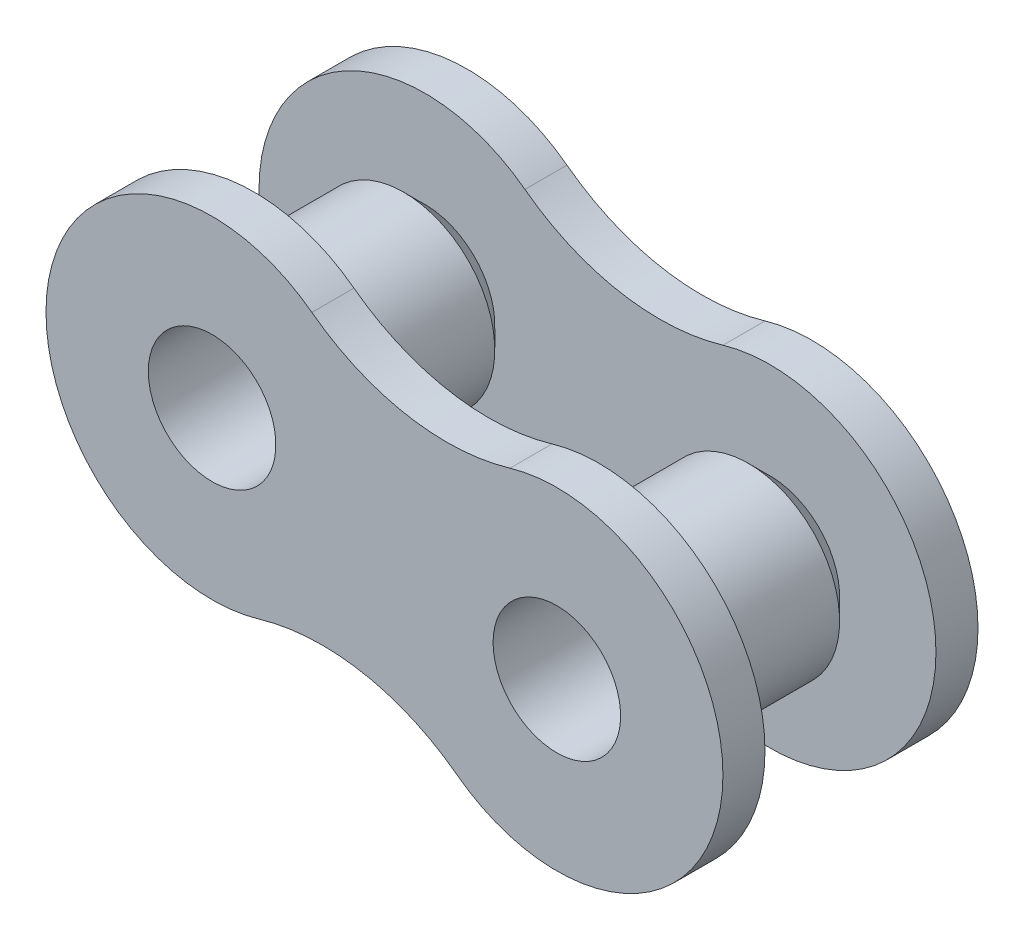
ISO-10303-21;
HEADER;
FILE_DESCRIPTION(('STEP AP214'),'2;1');
FILE_NAME('part.step','',(''),(''),'','','');
FILE_SCHEMA(('AUTOMOTIVE_DESIGN { 1 0 10303 214 1 1 1 1 }'));
ENDSEC;
DATA;
#1=APPLICATION_CONTEXT('core data for automotive mechanical design processes');
#2=APPLICATION_PROTOCOL_DEFINITION('international standard','automotive_design',2000,#1);
#3=PRODUCT_CONTEXT('',#1,'mechanical');
#4=PRODUCT('Part','Part','',(#3));
#5=PRODUCT_RELATED_PRODUCT_CATEGORY('part','',(#4));
#6=PRODUCT_DEFINITION_FORMATION('','',#4);
#7=PRODUCT_DEFINITION_CONTEXT('part definition',#1,'design');
#8=PRODUCT_DEFINITION('design','',#6,#7);
#9=PRODUCT_DEFINITION_SHAPE('','',#8);
#10=(LENGTH_UNIT() NAMED_UNIT(*) SI_UNIT(.MILLI.,.METRE.));
#11=(NAMED_UNIT(*) PLANE_ANGLE_UNIT() SI_UNIT($,.RADIAN.));
#12=(NAMED_UNIT(*) SI_UNIT($,.STERADIAN.) SOLID_ANGLE_UNIT());
#13=UNCERTAINTY_MEASURE_WITH_UNIT(LENGTH_MEASURE(1.E-05),#10,'distance_accuracy_value','');
#14=(GEOMETRIC_REPRESENTATION_CONTEXT(3) GLOBAL_UNCERTAINTY_ASSIGNED_CONTEXT((#13)) GLOBAL_UNIT_ASSIGNED_CONTEXT((#10,
#11,#12)) REPRESENTATION_CONTEXT('',''));
#15=CARTESIAN_POINT('',(0.,0.,0.));
#16=DIRECTION('',(0.,0.,1.));
#17=DIRECTION('',(1.,0.,0.));
#18=AXIS2_PLACEMENT_3D('',#15,#16,#17);
#19=CARTESIAN_POINT('',(112.401826251843,926.257414027199,-128.5494));
#20=DIRECTION('',(0.,0.,-1.));
#21=DIRECTION('',(0.,-1.,0.));
#22=AXIS2_PLACEMENT_3D('',#19,#20,#21);
#23=PLANE('',#22);
#24=CARTESIAN_POINT('',(109.277724445463,926.823640928158,-128.5494));
#25=DIRECTION('',(0.,0.,1.));
#26=DIRECTION('',(0.983969072875759,-0.178339181404476,0.));
#27=AXIS2_PLACEMENT_3D('',#24,#25,#26);
#28=CIRCLE('',#27,3.0099);
#29=CARTESIAN_POINT('',(111.086576936823,929.229373804954,-128.5494));
#30=VERTEX_POINT('',#29);
#31=CARTESIAN_POINT('',(110.127199162912,923.936100328545,-128.5494));
#32=VERTEX_POINT('',#31);
#33=EDGE_CURVE('E89',#30,#32,#28,.T.);
#34=ORIENTED_EDGE('',*,*,#33,.T.);
#35=CARTESIAN_POINT('',(111.274352618596,920.036688010283,-128.5494));
#36=DIRECTION('',(0.,0.,1.));
#37=DIRECTION('',(0.983969072875759,-0.178339181404476,0.));
#38=AXIS2_PLACEMENT_3D('',#35,#36,#37);
#39=CIRCLE('',#38,4.06464973628698);
#40=CARTESIAN_POINT('',(113.717075566864,923.285454249443,-128.5494));
#41=VERTEX_POINT('',#40);
#42=EDGE_CURVE('E81',#41,#32,#39,.T.);
#43=ORIENTED_EDGE('',*,*,#42,.F.);
#44=CARTESIAN_POINT('',(115.525928058224,925.691187126239,-128.5494));
#45=DIRECTION('',(0.,0.,1.));
#46=DIRECTION('',(0.983969072875759,-0.178339181404476,0.));
#47=AXIS2_PLACEMENT_3D('',#44,#45,#46);
#48=CIRCLE('',#47,3.0099);
#49=CARTESIAN_POINT('',(114.676453340775,928.578727725853,-128.5494));
#50=VERTEX_POINT('',#49);
#51=EDGE_CURVE('E65',#41,#50,#48,.T.);
#52=ORIENTED_EDGE('',*,*,#51,.T.);
#53=CARTESIAN_POINT('',(113.529299885091,932.478140044114,-128.5494));
#54=DIRECTION('',(0.,0.,1.));
#55=DIRECTION('',(0.983969072875759,-0.178339181404476,0.));
#56=AXIS2_PLACEMENT_3D('',#53,#54,#55);
#57=CIRCLE('',#56,4.06464973628691);
#58=EDGE_CURVE('E25',#30,#50,#57,.T.);
#59=ORIENTED_EDGE('',*,*,#58,.F.);
#60=EDGE_LOOP('',(#34,#43,#52,#59));
#61=FACE_BOUND('',#60,.T.);
#62=CARTESIAN_POINT('',(115.525928058224,925.691187126239,-128.5494));
#63=DIRECTION('',(0.,0.,1.));
#64=DIRECTION('',(0.983969072875759,-0.178339181404476,0.));
#65=AXIS2_PLACEMENT_3D('',#62,#63,#64);
#66=CIRCLE('',#65,1.26365);
#67=CARTESIAN_POINT('',(116.769320577163,925.465828819657,-128.5494));
#68=VERTEX_POINT('',#67);
#69=EDGE_CURVE('E189',#68,#68,#66,.T.);
#70=ORIENTED_EDGE('',*,*,#69,.F.);
#71=EDGE_LOOP('',(#70));
#72=FACE_BOUND('',#71,.T.);
#73=CARTESIAN_POINT('',(109.277724445463,926.823640928158,-128.5494));
#74=DIRECTION('',(0.,0.,1.));
#75=DIRECTION('',(0.983969072875759,-0.178339181404476,0.));
#76=AXIS2_PLACEMENT_3D('',#73,#74,#75);
#77=CIRCLE('',#76,1.26365);
#78=CARTESIAN_POINT('',(110.521116964402,926.598282621576,-128.5494));
#79=VERTEX_POINT('',#78);
#80=EDGE_CURVE('E185',#79,#79,#77,.T.);
#81=ORIENTED_EDGE('',*,*,#80,.F.);
#82=EDGE_LOOP('',(#81));
#83=FACE_BOUND('',#82,.T.);
#84=ADVANCED_FACE('F17',(#61,#72,#83),#23,.F.);
#85=CARTESIAN_POINT('',(112.401826251843,926.257414027199,-129.3114));
#86=DIRECTION('',(0.,0.,-1.));
#87=DIRECTION('',(0.,-1.,0.));
#88=AXIS2_PLACEMENT_3D('',#85,#86,#87);
#89=PLANE('',#88);
#90=CARTESIAN_POINT('',(109.277724445463,926.823640928158,-129.3114));
#91=DIRECTION('',(0.,0.,1.));
#92=DIRECTION('',(0.983969072875759,-0.178339181404476,0.));
#93=AXIS2_PLACEMENT_3D('',#90,#91,#92);
#94=CIRCLE('',#93,1.1557);
#95=CARTESIAN_POINT('',(110.414897502986,926.617534336209,-129.3114));
#96=VERTEX_POINT('',#95);
#97=EDGE_CURVE('E280',#96,#96,#94,.T.);
#98=ORIENTED_EDGE('',*,*,#97,.T.);
#99=EDGE_LOOP('',(#98));
#100=FACE_BOUND('',#99,.T.);
#101=CARTESIAN_POINT('',(115.525928058224,925.691187126239,-129.3114));
#102=DIRECTION('',(0.,0.,1.));
#103=DIRECTION('',(0.983969072875759,-0.178339181404476,0.));
#104=AXIS2_PLACEMENT_3D('',#101,#102,#103);
#105=CIRCLE('',#104,1.1557);
#106=CARTESIAN_POINT('',(116.663101115747,925.48508053429,-129.3114));
#107=VERTEX_POINT('',#106);
#108=EDGE_CURVE('E111',#107,#107,#105,.T.);
#109=ORIENTED_EDGE('',*,*,#108,.T.);
#110=EDGE_LOOP('',(#109));
#111=FACE_BOUND('',#110,.T.);
#112=CARTESIAN_POINT('',(109.277724445463,926.823640928158,-129.3114));
#113=DIRECTION('',(0.,0.,1.));
#114=DIRECTION('',(0.983969072875759,-0.178339181404476,0.));
#115=AXIS2_PLACEMENT_3D('',#112,#113,#114);
#116=CIRCLE('',#115,3.0099);
#117=CARTESIAN_POINT('',(111.086576936823,929.229373804954,-129.3114));
#118=VERTEX_POINT('',#117);
#119=CARTESIAN_POINT('',(110.127199162912,923.936100328545,-129.3114));
#120=VERTEX_POINT('',#119);
#121=EDGE_CURVE('E97',#118,#120,#116,.T.);
#122=ORIENTED_EDGE('',*,*,#121,.F.);
#123=CARTESIAN_POINT('',(113.529299885091,932.478140044114,-129.3114));
#124=DIRECTION('',(0.,0.,1.));
#125=DIRECTION('',(0.983969072875759,-0.178339181404476,0.));
#126=AXIS2_PLACEMENT_3D('',#123,#124,#125);
#127=CIRCLE('',#126,4.06464973628691);
#128=CARTESIAN_POINT('',(114.676453340775,928.578727725853,-129.3114));
#129=VERTEX_POINT('',#128);
#130=EDGE_CURVE('E11',#118,#129,#127,.T.);
#131=ORIENTED_EDGE('',*,*,#130,.T.);
#132=CARTESIAN_POINT('',(115.525928058224,925.691187126239,-129.3114));
#133=DIRECTION('',(0.,0.,1.));
#134=DIRECTION('',(0.983969072875759,-0.178339181404476,0.));
#135=AXIS2_PLACEMENT_3D('',#132,#133,#134);
#136=CIRCLE('',#135,3.0099);
#137=CARTESIAN_POINT('',(113.717075566864,923.285454249443,-129.3114));
#138=VERTEX_POINT('',#137);
#139=EDGE_CURVE('E75',#138,#129,#136,.T.);
#140=ORIENTED_EDGE('',*,*,#139,.F.);
#141=CARTESIAN_POINT('',(111.274352618596,920.036688010283,-129.3114));
#142=DIRECTION('',(0.,0.,1.));
#143=DIRECTION('',(0.983969072875759,-0.178339181404476,0.));
#144=AXIS2_PLACEMENT_3D('',#141,#142,#143);
#145=CIRCLE('',#144,4.06464973628698);
#146=EDGE_CURVE('E83',#138,#120,#145,.T.);
#147=ORIENTED_EDGE('',*,*,#146,.T.);
#148=EDGE_LOOP('',(#122,#131,#140,#147));
#149=FACE_BOUND('',#148,.T.);
#150=ADVANCED_FACE('F200',(#100,#111,#149),#89,.T.);
#151=CARTESIAN_POINT('',(113.529299885091,932.478140044114,-129.3114));
#152=DIRECTION('',(0.,0.,1.));
#153=DIRECTION('',(-0.983969072875759,0.178339181404476,0.));
#154=AXIS2_PLACEMENT_3D('',#151,#152,#153);
#155=CYLINDRICAL_SURFACE('',#154,4.06464973628691);
#156=ORIENTED_EDGE('',*,*,#58,.T.);
#157=DIRECTION('',(0.,0.,1.));
#158=VECTOR('',#157,1.);
#159=CARTESIAN_POINT('',(114.676453340775,928.578727725853,-129.3114));
#160=LINE('',#159,#158);
#161=EDGE_CURVE('E71',#129,#50,#160,.T.);
#162=ORIENTED_EDGE('',*,*,#161,.F.);
#163=ORIENTED_EDGE('',*,*,#130,.F.);
#164=DIRECTION('',(0.,0.,1.));
#165=VECTOR('',#164,1.);
#166=CARTESIAN_POINT('',(111.086576936823,929.229373804954,-129.3114));
#167=LINE('',#166,#165);
#168=EDGE_CURVE('E175',#118,#30,#167,.T.);
#169=ORIENTED_EDGE('',*,*,#168,.T.);
#170=EDGE_LOOP('',(#156,#162,#163,#169));
#171=FACE_BOUND('',#170,.T.);
#172=ADVANCED_FACE('F202',(#171),#155,.F.);
#173=CARTESIAN_POINT('',(115.525928058224,925.691187126239,-129.3114));
#174=DIRECTION('',(0.,0.,1.));
#175=DIRECTION('',(-0.983969072875759,0.178339181404476,0.));
#176=AXIS2_PLACEMENT_3D('',#173,#174,#175);
#177=CYLINDRICAL_SURFACE('',#176,3.0099);
#178=ORIENTED_EDGE('',*,*,#51,.F.);
#179=DIRECTION('',(0.,0.,1.));
#180=VECTOR('',#179,1.);
#181=CARTESIAN_POINT('',(113.717075566864,923.285454249443,-129.3114));
#182=LINE('',#181,#180);
#183=EDGE_CURVE('E69',#138,#41,#182,.T.);
#184=ORIENTED_EDGE('',*,*,#183,.F.);
#185=ORIENTED_EDGE('',*,*,#139,.T.);
#186=ORIENTED_EDGE('',*,*,#161,.T.);
#187=EDGE_LOOP('',(#178,#184,#185,#186));
#188=FACE_BOUND('',#187,.T.);
#189=ADVANCED_FACE('F67',(#188),#177,.T.);
#190=CARTESIAN_POINT('',(111.274352618596,920.036688010283,-129.3114));
#191=DIRECTION('',(0.,0.,1.));
#192=DIRECTION('',(-0.983969072875759,0.178339181404476,0.));
#193=AXIS2_PLACEMENT_3D('',#190,#191,#192);
#194=CYLINDRICAL_SURFACE('',#193,4.06464973628698);
#195=ORIENTED_EDGE('',*,*,#42,.T.);
#196=DIRECTION('',(0.,0.,1.));
#197=VECTOR('',#196,1.);
#198=CARTESIAN_POINT('',(110.127199162912,923.936100328545,-129.3114));
#199=LINE('',#198,#197);
#200=EDGE_CURVE('E91',#120,#32,#199,.T.);
#201=ORIENTED_EDGE('',*,*,#200,.F.);
#202=ORIENTED_EDGE('',*,*,#146,.F.);
#203=ORIENTED_EDGE('',*,*,#183,.T.);
#204=EDGE_LOOP('',(#195,#201,#202,#203));
#205=FACE_BOUND('',#204,.T.);
#206=ADVANCED_FACE('F79',(#205),#194,.F.);
#207=CARTESIAN_POINT('',(109.277724445463,926.823640928158,-129.3114));
#208=DIRECTION('',(0.,0.,1.));
#209=DIRECTION('',(-0.983969072875759,0.178339181404476,0.));
#210=AXIS2_PLACEMENT_3D('',#207,#208,#209);
#211=CYLINDRICAL_SURFACE('',#210,3.0099);
#212=ORIENTED_EDGE('',*,*,#33,.F.);
#213=ORIENTED_EDGE('',*,*,#168,.F.);
#214=ORIENTED_EDGE('',*,*,#121,.T.);
#215=ORIENTED_EDGE('',*,*,#200,.T.);
#216=EDGE_LOOP('',(#212,#213,#214,#215));
#217=FACE_BOUND('',#216,.T.);
#218=ADVANCED_FACE('F199',(#217),#211,.T.);
#219=CARTESIAN_POINT('',(115.525928058224,925.691187126239,-128.5494));
#220=DIRECTION('',(0.,0.,1.));
#221=DIRECTION('',(-0.983969072875759,0.178339181404476,0.));
#222=AXIS2_PLACEMENT_3D('',#219,#220,#221);
#223=CONICAL_SURFACE('',#222,1.26365,0.785398163397448);
#224=ORIENTED_EDGE('',*,*,#69,.T.);
#225=EDGE_LOOP('',(#224));
#226=FACE_BOUND('',#225,.T.);
#227=CARTESIAN_POINT('',(115.525928058224,925.691187126239,-128.16205));
#228=DIRECTION('',(0.,0.,-1.));
#229=DIRECTION('',(0.983969072875759,-0.178339181404476,0.));
#230=AXIS2_PLACEMENT_3D('',#227,#228,#229);
#231=CIRCLE('',#230,1.651);
#232=CARTESIAN_POINT('',(117.150460997542,925.39674913774,-128.16205));
#233=VERTEX_POINT('',#232);
#234=EDGE_CURVE('E118',#233,#233,#231,.T.);
#235=ORIENTED_EDGE('',*,*,#234,.T.);
#236=EDGE_LOOP('',(#235));
#237=FACE_BOUND('',#236,.T.);
#238=ADVANCED_FACE('F217',(#226,#237),#223,.T.);
#239=CARTESIAN_POINT('',(109.277724445463,926.823640928158,-128.5494));
#240=DIRECTION('',(0.,0.,1.));
#241=DIRECTION('',(-0.983969072875759,0.178339181404476,0.));
#242=AXIS2_PLACEMENT_3D('',#239,#240,#241);
#243=CONICAL_SURFACE('',#242,1.26365,0.785398163397448);
#244=ORIENTED_EDGE('',*,*,#80,.T.);
#245=EDGE_LOOP('',(#244));
#246=FACE_BOUND('',#245,.T.);
#247=CARTESIAN_POINT('',(109.277724445463,926.823640928158,-128.16205));
#248=DIRECTION('',(0.,0.,-1.));
#249=DIRECTION('',(0.983969072875759,-0.178339181404476,0.));
#250=AXIS2_PLACEMENT_3D('',#247,#248,#249);
#251=CIRCLE('',#250,1.651);
#252=CARTESIAN_POINT('',(110.902257384781,926.529202939659,-128.16205));
#253=VERTEX_POINT('',#252);
#254=EDGE_CURVE('E113',#253,#253,#251,.T.);
#255=ORIENTED_EDGE('',*,*,#254,.T.);
#256=EDGE_LOOP('',(#255));
#257=FACE_BOUND('',#256,.T.);
#258=ADVANCED_FACE('F220',(#246,#257),#243,.T.);
#259=CARTESIAN_POINT('',(112.401826251843,926.257414027199,-125.4506));
#260=DIRECTION('',(0.,0.,1.));
#261=DIRECTION('',(1.,0.,0.));
#262=AXIS2_PLACEMENT_3D('',#259,#260,#261);
#263=PLANE('',#262);
#264=CARTESIAN_POINT('',(109.277724445463,926.823640928158,-125.4506));
#265=DIRECTION('',(0.,0.,1.));
#266=DIRECTION('',(0.983969072875759,-0.178339181404476,0.));
#267=AXIS2_PLACEMENT_3D('',#264,#265,#266);
#268=CIRCLE('',#267,3.0099);
#269=CARTESIAN_POINT('',(111.086576936823,929.229373804954,-125.4506));
#270=VERTEX_POINT('',#269);
#271=CARTESIAN_POINT('',(110.127199162912,923.936100328545,-125.4506));
#272=VERTEX_POINT('',#271);
#273=EDGE_CURVE('E128',#270,#272,#268,.T.);
#274=ORIENTED_EDGE('',*,*,#273,.F.);
#275=CARTESIAN_POINT('',(113.529299885091,932.478140044114,-125.4506));
#276=DIRECTION('',(0.,0.,1.));
#277=DIRECTION('',(0.983969072875759,-0.178339181404476,0.));
#278=AXIS2_PLACEMENT_3D('',#275,#276,#277);
#279=CIRCLE('',#278,4.06464973628691);
#280=CARTESIAN_POINT('',(114.676453340775,928.578727725853,-125.4506));
#281=VERTEX_POINT('',#280);
#282=EDGE_CURVE('E173',#270,#281,#279,.T.);
#283=ORIENTED_EDGE('',*,*,#282,.T.);
#284=CARTESIAN_POINT('',(115.525928058224,925.691187126239,-125.4506));
#285=DIRECTION('',(0.,0.,1.));
#286=DIRECTION('',(0.983969072875759,-0.178339181404476,0.));
#287=AXIS2_PLACEMENT_3D('',#284,#285,#286);
#288=CIRCLE('',#287,3.0099);
#289=CARTESIAN_POINT('',(113.717075566864,923.285454249443,-125.4506));
#290=VERTEX_POINT('',#289);
#291=EDGE_CURVE('E144',#290,#281,#288,.T.);
#292=ORIENTED_EDGE('',*,*,#291,.F.);
#293=CARTESIAN_POINT('',(111.274352618596,920.036688010283,-125.4506));
#294=DIRECTION('',(0.,0.,1.));
#295=DIRECTION('',(0.983969072875759,-0.178339181404476,0.));
#296=AXIS2_PLACEMENT_3D('',#293,#294,#295);
#297=CIRCLE('',#296,4.06464973628698);
#298=EDGE_CURVE('E153',#290,#272,#297,.T.);
#299=ORIENTED_EDGE('',*,*,#298,.T.);
#300=EDGE_LOOP('',(#274,#283,#292,#299));
#301=FACE_BOUND('',#300,.T.);
#302=CARTESIAN_POINT('',(115.525928058224,925.691187126239,-125.4506));
#303=DIRECTION('',(0.,0.,1.));
#304=DIRECTION('',(0.983969072875759,-0.178339181404476,0.));
#305=AXIS2_PLACEMENT_3D('',#302,#303,#304);
#306=CIRCLE('',#305,1.26365);
#307=CARTESIAN_POINT('',(116.769320577163,925.465828819657,-125.4506));
#308=VERTEX_POINT('',#307);
#309=EDGE_CURVE('E122',#308,#308,#306,.T.);
#310=ORIENTED_EDGE('',*,*,#309,.T.);
#311=EDGE_LOOP('',(#310));
#312=FACE_BOUND('',#311,.T.);
#313=CARTESIAN_POINT('',(109.277724445463,926.823640928158,-125.4506));
#314=DIRECTION('',(0.,0.,1.));
#315=DIRECTION('',(0.983969072875759,-0.178339181404476,0.));
#316=AXIS2_PLACEMENT_3D('',#313,#314,#315);
#317=CIRCLE('',#316,1.26365);
#318=CARTESIAN_POINT('',(110.521116964402,926.598282621576,-125.4506));
#319=VERTEX_POINT('',#318);
#320=EDGE_CURVE('E116',#319,#319,#317,.T.);
#321=ORIENTED_EDGE('',*,*,#320,.T.);
#322=EDGE_LOOP('',(#321));
#323=FACE_BOUND('',#322,.T.);
#324=ADVANCED_FACE('F224',(#301,#312,#323),#263,.F.);
#325=CARTESIAN_POINT('',(112.401826251843,926.257414027199,-124.6886));
#326=DIRECTION('',(0.,0.,1.));
#327=DIRECTION('',(1.,0.,0.));
#328=AXIS2_PLACEMENT_3D('',#325,#326,#327);
#329=PLANE('',#328);
#330=CARTESIAN_POINT('',(109.277724445463,926.823640928158,-124.6886));
#331=DIRECTION('',(0.,0.,1.));
#332=DIRECTION('',(0.983969072875759,-0.178339181404476,0.));
#333=AXIS2_PLACEMENT_3D('',#330,#331,#332);
#334=CIRCLE('',#333,1.1557);
#335=CARTESIAN_POINT('',(110.414897502986,926.617534336209,-124.6886));
#336=VERTEX_POINT('',#335);
#337=EDGE_CURVE('E284',#336,#336,#334,.T.);
#338=ORIENTED_EDGE('',*,*,#337,.F.);
#339=EDGE_LOOP('',(#338));
#340=FACE_BOUND('',#339,.T.);
#341=CARTESIAN_POINT('',(115.525928058224,925.691187126239,-124.6886));
#342=DIRECTION('',(0.,0.,1.));
#343=DIRECTION('',(0.983969072875759,-0.178339181404476,0.));
#344=AXIS2_PLACEMENT_3D('',#341,#342,#343);
#345=CIRCLE('',#344,1.1557);
#346=CARTESIAN_POINT('',(116.663101115747,925.48508053429,-124.6886));
#347=VERTEX_POINT('',#346);
#348=EDGE_CURVE('E127',#347,#347,#345,.T.);
#349=ORIENTED_EDGE('',*,*,#348,.F.);
#350=EDGE_LOOP('',(#349));
#351=FACE_BOUND('',#350,.T.);
#352=CARTESIAN_POINT('',(109.277724445463,926.823640928158,-124.6886));
#353=DIRECTION('',(0.,0.,1.));
#354=DIRECTION('',(0.983969072875759,-0.178339181404476,0.));
#355=AXIS2_PLACEMENT_3D('',#352,#353,#354);
#356=CIRCLE('',#355,3.0099);
#357=CARTESIAN_POINT('',(111.086576936823,929.229373804954,-124.6886));
#358=VERTEX_POINT('',#357);
#359=CARTESIAN_POINT('',(110.127199162912,923.936100328545,-124.6886));
#360=VERTEX_POINT('',#359);
#361=EDGE_CURVE('E148',#358,#360,#356,.T.);
#362=ORIENTED_EDGE('',*,*,#361,.T.);
#363=CARTESIAN_POINT('',(111.274352618596,920.036688010283,-124.6886));
#364=DIRECTION('',(0.,0.,1.));
#365=DIRECTION('',(0.983969072875759,-0.178339181404476,0.));
#366=AXIS2_PLACEMENT_3D('',#363,#364,#365);
#367=CIRCLE('',#366,4.06464973628698);
#368=CARTESIAN_POINT('',(113.717075566864,923.285454249443,-124.6886));
#369=VERTEX_POINT('',#368);
#370=EDGE_CURVE('E164',#369,#360,#367,.T.);
#371=ORIENTED_EDGE('',*,*,#370,.F.);
#372=CARTESIAN_POINT('',(115.525928058224,925.691187126239,-124.6886));
#373=DIRECTION('',(0.,0.,1.));
#374=DIRECTION('',(0.983969072875759,-0.178339181404476,0.));
#375=AXIS2_PLACEMENT_3D('',#372,#373,#374);
#376=CIRCLE('',#375,3.0099);
#377=CARTESIAN_POINT('',(114.676453340775,928.578727725853,-124.6886));
#378=VERTEX_POINT('',#377);
#379=EDGE_CURVE('E143',#369,#378,#376,.T.);
#380=ORIENTED_EDGE('',*,*,#379,.T.);
#381=CARTESIAN_POINT('',(113.529299885091,932.478140044114,-124.6886));
#382=DIRECTION('',(0.,0.,1.));
#383=DIRECTION('',(0.983969072875759,-0.178339181404476,0.));
#384=AXIS2_PLACEMENT_3D('',#381,#382,#383);
#385=CIRCLE('',#384,4.06464973628691);
#386=EDGE_CURVE('E181',#358,#378,#385,.T.);
#387=ORIENTED_EDGE('',*,*,#386,.F.);
#388=EDGE_LOOP('',(#362,#371,#380,#387));
#389=FACE_BOUND('',#388,.T.);
#390=ADVANCED_FACE('F230',(#340,#351,#389),#329,.T.);
#391=CARTESIAN_POINT('',(113.529299885091,932.478140044114,-124.6886));
#392=DIRECTION('',(0.,0.,-1.));
#393=DIRECTION('',(-0.983969072875759,0.178339181404476,0.));
#394=AXIS2_PLACEMENT_3D('',#391,#392,#393);
#395=CYLINDRICAL_SURFACE('',#394,4.06464973628691);
#396=ORIENTED_EDGE('',*,*,#282,.F.);
#397=DIRECTION('',(0.,0.,-1.));
#398=VECTOR('',#397,1.);
#399=CARTESIAN_POINT('',(111.086576936823,929.229373804954,-124.6886));
#400=LINE('',#399,#398);
#401=EDGE_CURVE('E152',#358,#270,#400,.T.);
#402=ORIENTED_EDGE('',*,*,#401,.F.);
#403=ORIENTED_EDGE('',*,*,#386,.T.);
#404=DIRECTION('',(0.,0.,-1.));
#405=VECTOR('',#404,1.);
#406=CARTESIAN_POINT('',(114.676453340775,928.578727725853,-124.6886));
#407=LINE('',#406,#405);
#408=EDGE_CURVE('E139',#378,#281,#407,.T.);
#409=ORIENTED_EDGE('',*,*,#408,.T.);
#410=EDGE_LOOP('',(#396,#402,#403,#409));
#411=FACE_BOUND('',#410,.T.);
#412=ADVANCED_FACE('F226',(#411),#395,.F.);
#413=CARTESIAN_POINT('',(115.525928058224,925.691187126239,-124.6886));
#414=DIRECTION('',(0.,0.,-1.));
#415=DIRECTION('',(-0.983969072875759,0.178339181404476,0.));
#416=AXIS2_PLACEMENT_3D('',#413,#414,#415);
#417=CYLINDRICAL_SURFACE('',#416,3.0099);
#418=ORIENTED_EDGE('',*,*,#291,.T.);
#419=ORIENTED_EDGE('',*,*,#408,.F.);
#420=ORIENTED_EDGE('',*,*,#379,.F.);
#421=DIRECTION('',(0.,0.,-1.));
#422=VECTOR('',#421,1.);
#423=CARTESIAN_POINT('',(113.717075566864,923.285454249443,-124.6886));
#424=LINE('',#423,#422);
#425=EDGE_CURVE('E157',#369,#290,#424,.T.);
#426=ORIENTED_EDGE('',*,*,#425,.T.);
#427=EDGE_LOOP('',(#418,#419,#420,#426));
#428=FACE_BOUND('',#427,.T.);
#429=ADVANCED_FACE('F229',(#428),#417,.T.);
#430=CARTESIAN_POINT('',(111.274352618596,920.036688010283,-124.6886));
#431=DIRECTION('',(0.,0.,-1.));
#432=DIRECTION('',(-0.983969072875759,0.178339181404476,0.));
#433=AXIS2_PLACEMENT_3D('',#430,#431,#432);
#434=CYLINDRICAL_SURFACE('',#433,4.06464973628698);
#435=ORIENTED_EDGE('',*,*,#298,.F.);
#436=ORIENTED_EDGE('',*,*,#425,.F.);
#437=ORIENTED_EDGE('',*,*,#370,.T.);
#438=DIRECTION('',(0.,0.,-1.));
#439=VECTOR('',#438,1.);
#440=CARTESIAN_POINT('',(110.127199162912,923.936100328545,-124.6886));
#441=LINE('',#440,#439);
#442=EDGE_CURVE('E132',#360,#272,#441,.T.);
#443=ORIENTED_EDGE('',*,*,#442,.T.);
#444=EDGE_LOOP('',(#435,#436,#437,#443));
#445=FACE_BOUND('',#444,.T.);
#446=ADVANCED_FACE('F234',(#445),#434,.F.);
#447=CARTESIAN_POINT('',(109.277724445463,926.823640928158,-124.6886));
#448=DIRECTION('',(0.,0.,-1.));
#449=DIRECTION('',(-0.983969072875759,0.178339181404476,0.));
#450=AXIS2_PLACEMENT_3D('',#447,#448,#449);
#451=CYLINDRICAL_SURFACE('',#450,3.0099);
#452=ORIENTED_EDGE('',*,*,#273,.T.);
#453=ORIENTED_EDGE('',*,*,#442,.F.);
#454=ORIENTED_EDGE('',*,*,#361,.F.);
#455=ORIENTED_EDGE('',*,*,#401,.T.);
#456=EDGE_LOOP('',(#452,#453,#454,#455));
#457=FACE_BOUND('',#456,.T.);
#458=ADVANCED_FACE('F236',(#457),#451,.T.);
#459=CARTESIAN_POINT('',(115.525928058224,925.691187126239,-125.4506));
#460=DIRECTION('',(0.,0.,-1.));
#461=DIRECTION('',(-0.983969072875759,0.178339181404476,0.));
#462=AXIS2_PLACEMENT_3D('',#459,#460,#461);
#463=CONICAL_SURFACE('',#462,1.26365,0.785398163397448);
#464=ORIENTED_EDGE('',*,*,#309,.F.);
#465=EDGE_LOOP('',(#464));
#466=FACE_BOUND('',#465,.T.);
#467=CARTESIAN_POINT('',(115.525928058224,925.691187126239,-125.83795));
#468=DIRECTION('',(0.,0.,-1.));
#469=DIRECTION('',(0.983969072875759,-0.178339181404476,0.));
#470=AXIS2_PLACEMENT_3D('',#467,#468,#469);
#471=CIRCLE('',#470,1.651);
#472=CARTESIAN_POINT('',(117.150460997542,925.39674913774,-125.83795));
#473=VERTEX_POINT('',#472);
#474=EDGE_CURVE('E123',#473,#473,#471,.T.);
#475=ORIENTED_EDGE('',*,*,#474,.F.);
#476=EDGE_LOOP('',(#475));
#477=FACE_BOUND('',#476,.T.);
#478=ADVANCED_FACE('F239',(#466,#477),#463,.T.);
#479=CARTESIAN_POINT('',(115.525928058224,925.691187126239,-125.4506));
#480=DIRECTION('',(0.,0.,-1.));
#481=DIRECTION('',(-0.983969072875759,0.178339181404476,0.));
#482=AXIS2_PLACEMENT_3D('',#479,#480,#481);
#483=CYLINDRICAL_SURFACE('',#482,1.651);
#484=ORIENTED_EDGE('',*,*,#234,.F.);
#485=EDGE_LOOP('',(#484));
#486=FACE_BOUND('',#485,.T.);
#487=ORIENTED_EDGE('',*,*,#474,.T.);
#488=EDGE_LOOP('',(#487));
#489=FACE_BOUND('',#488,.T.);
#490=ADVANCED_FACE('F246',(#486,#489),#483,.T.);
#491=CARTESIAN_POINT('',(115.525928058224,925.691187126239,-125.4506));
#492=DIRECTION('',(0.,0.,-1.));
#493=DIRECTION('',(-0.983969072875759,0.178339181404476,0.));
#494=AXIS2_PLACEMENT_3D('',#491,#492,#493);
#495=CYLINDRICAL_SURFACE('',#494,1.1557);
#496=ORIENTED_EDGE('',*,*,#108,.F.);
#497=EDGE_LOOP('',(#496));
#498=FACE_BOUND('',#497,.T.);
#499=ORIENTED_EDGE('',*,*,#348,.T.);
#500=EDGE_LOOP('',(#499));
#501=FACE_BOUND('',#500,.T.);
#502=ADVANCED_FACE('F250',(#498,#501),#495,.F.);
#503=CARTESIAN_POINT('',(109.277724445463,926.823640928158,-125.4506));
#504=DIRECTION('',(0.,0.,-1.));
#505=DIRECTION('',(-0.983969072875759,0.178339181404476,0.));
#506=AXIS2_PLACEMENT_3D('',#503,#504,#505);
#507=CONICAL_SURFACE('',#506,1.26365,0.785398163397448);
#508=ORIENTED_EDGE('',*,*,#320,.F.);
#509=EDGE_LOOP('',(#508));
#510=FACE_BOUND('',#509,.T.);
#511=CARTESIAN_POINT('',(109.277724445463,926.823640928158,-125.83795));
#512=DIRECTION('',(0.,0.,-1.));
#513=DIRECTION('',(0.983969072875759,-0.178339181404476,0.));
#514=AXIS2_PLACEMENT_3D('',#511,#512,#513);
#515=CIRCLE('',#514,1.651);
#516=CARTESIAN_POINT('',(110.902257384781,926.529202939659,-125.83795));
#517=VERTEX_POINT('',#516);
#518=EDGE_CURVE('E117',#517,#517,#515,.T.);
#519=ORIENTED_EDGE('',*,*,#518,.F.);
#520=EDGE_LOOP('',(#519));
#521=FACE_BOUND('',#520,.T.);
#522=ADVANCED_FACE('F257',(#510,#521),#507,.T.);
#523=CARTESIAN_POINT('',(109.277724445463,926.823640928158,-125.4506));
#524=DIRECTION('',(0.,0.,-1.));
#525=DIRECTION('',(-0.983969072875759,0.178339181404476,0.));
#526=AXIS2_PLACEMENT_3D('',#523,#524,#525);
#527=CYLINDRICAL_SURFACE('',#526,1.651);
#528=ORIENTED_EDGE('',*,*,#254,.F.);
#529=EDGE_LOOP('',(#528));
#530=FACE_BOUND('',#529,.T.);
#531=ORIENTED_EDGE('',*,*,#518,.T.);
#532=EDGE_LOOP('',(#531));
#533=FACE_BOUND('',#532,.T.);
#534=ADVANCED_FACE('F260',(#530,#533),#527,.T.);
#535=CARTESIAN_POINT('',(109.277724445463,926.823640928158,-125.4506));
#536=DIRECTION('',(0.,0.,-1.));
#537=DIRECTION('',(-0.983969072875759,0.178339181404476,0.));
#538=AXIS2_PLACEMENT_3D('',#535,#536,#537);
#539=CYLINDRICAL_SURFACE('',#538,1.1557);
#540=ORIENTED_EDGE('',*,*,#97,.F.);
#541=EDGE_LOOP('',(#540));
#542=FACE_BOUND('',#541,.T.);
#543=ORIENTED_EDGE('',*,*,#337,.T.);
#544=EDGE_LOOP('',(#543));
#545=FACE_BOUND('',#544,.T.);
#546=ADVANCED_FACE('F264',(#542,#545),#539,.F.);
#547=CLOSED_SHELL('',(#84,#150,#172,#189,#206,#218,#238,#258,#324,#390,#412,#429,#446,#458,#478,
#490,#502,#522,#534,#546));
#548=MANIFOLD_SOLID_BREP('B1',#547);
#549=ADVANCED_BREP_SHAPE_REPRESENTATION('',(#18,#548),#14);
#550=SHAPE_DEFINITION_REPRESENTATION(#9,#549);
ENDSEC;
END-ISO-10303-21;
